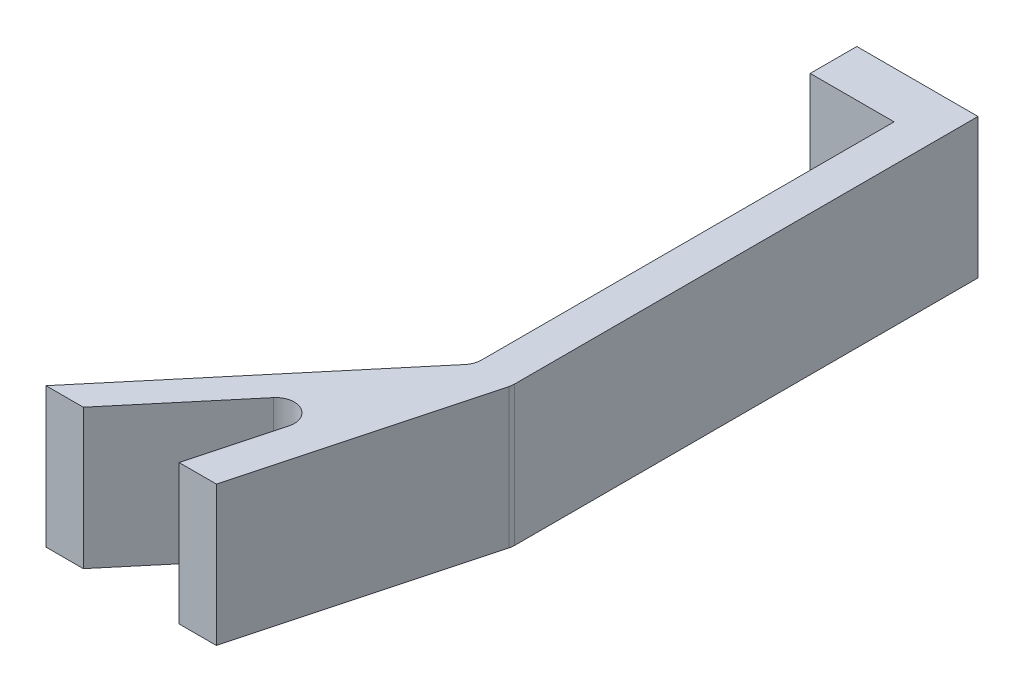
ISO-10303-21;
HEADER;
FILE_DESCRIPTION(('STEP AP214'),'2;1');
FILE_NAME('part.step','',(''),(''),'','','');
FILE_SCHEMA(('AUTOMOTIVE_DESIGN { 1 0 10303 214 1 1 1 1 }'));
ENDSEC;
DATA;
#1=APPLICATION_CONTEXT('core data for automotive mechanical design processes');
#2=APPLICATION_PROTOCOL_DEFINITION('international standard','automotive_design',2000,#1);
#3=PRODUCT_CONTEXT('',#1,'mechanical');
#4=PRODUCT('Part','Part','',(#3));
#5=PRODUCT_RELATED_PRODUCT_CATEGORY('part','',(#4));
#6=PRODUCT_DEFINITION_FORMATION('','',#4);
#7=PRODUCT_DEFINITION_CONTEXT('part definition',#1,'design');
#8=PRODUCT_DEFINITION('design','',#6,#7);
#9=PRODUCT_DEFINITION_SHAPE('','',#8);
#10=(LENGTH_UNIT() NAMED_UNIT(*) SI_UNIT(.MILLI.,.METRE.));
#11=(NAMED_UNIT(*) PLANE_ANGLE_UNIT() SI_UNIT($,.RADIAN.));
#12=(NAMED_UNIT(*) SI_UNIT($,.STERADIAN.) SOLID_ANGLE_UNIT());
#13=UNCERTAINTY_MEASURE_WITH_UNIT(LENGTH_MEASURE(1.E-05),#10,'distance_accuracy_value','');
#14=(GEOMETRIC_REPRESENTATION_CONTEXT(3) GLOBAL_UNCERTAINTY_ASSIGNED_CONTEXT((#13)) GLOBAL_UNIT_ASSIGNED_CONTEXT((#10,
#11,#12)) REPRESENTATION_CONTEXT('',''));
#15=CARTESIAN_POINT('',(0.,0.,0.));
#16=DIRECTION('',(0.,0.,1.));
#17=DIRECTION('',(1.,0.,0.));
#18=AXIS2_PLACEMENT_3D('',#15,#16,#17);
#19=CARTESIAN_POINT('',(2.,15.,-50.));
#20=DIRECTION('',(0.,0.,1.));
#21=DIRECTION('',(1.,0.,0.));
#22=AXIS2_PLACEMENT_3D('',#19,#20,#21);
#23=PLANE('',#22);
#24=CARTESIAN_POINT('',(-4.5,7.5,-50.));
#25=DIRECTION('',(0.,0.,-1.));
#26=DIRECTION('',(-1.,0.,0.));
#27=AXIS2_PLACEMENT_3D('',#24,#25,#26);
#28=CIRCLE('',#27,1.5);
#29=CARTESIAN_POINT('',(-6.,7.5,-50.));
#30=VERTEX_POINT('',#29);
#31=EDGE_CURVE('E275',#30,#30,#28,.T.);
#32=ORIENTED_EDGE('',*,*,#31,.F.);
#33=EDGE_LOOP('',(#32));
#34=FACE_BOUND('',#33,.T.);
#35=DIRECTION('',(-1.,0.,0.));
#36=VECTOR('',#35,1.);
#37=CARTESIAN_POINT('',(2.,0.,-50.));
#38=LINE('',#37,#36);
#39=CARTESIAN_POINT('',(2.,0.,-50.));
#40=VERTEX_POINT('',#39);
#41=CARTESIAN_POINT('',(-11.,0.,-50.));
#42=VERTEX_POINT('',#41);
#43=EDGE_CURVE('E170',#40,#42,#38,.T.);
#44=ORIENTED_EDGE('',*,*,#43,.T.);
#45=DIRECTION('',(0.,-1.,0.));
#46=VECTOR('',#45,1.);
#47=CARTESIAN_POINT('',(-11.,15.,-50.));
#48=LINE('',#47,#46);
#49=CARTESIAN_POINT('',(-11.,15.,-50.));
#50=VERTEX_POINT('',#49);
#51=EDGE_CURVE('E42',#50,#42,#48,.T.);
#52=ORIENTED_EDGE('',*,*,#51,.F.);
#53=DIRECTION('',(-1.,0.,0.));
#54=VECTOR('',#53,1.);
#55=CARTESIAN_POINT('',(2.,15.,-50.));
#56=LINE('',#55,#54);
#57=CARTESIAN_POINT('',(2.,15.,-50.));
#58=VERTEX_POINT('',#57);
#59=EDGE_CURVE('E112',#58,#50,#56,.T.);
#60=ORIENTED_EDGE('',*,*,#59,.F.);
#61=DIRECTION('',(0.,-1.,0.));
#62=VECTOR('',#61,1.);
#63=CARTESIAN_POINT('',(2.,15.,-50.));
#64=LINE('',#63,#62);
#65=EDGE_CURVE('E11',#58,#40,#64,.T.);
#66=ORIENTED_EDGE('',*,*,#65,.T.);
#67=EDGE_LOOP('',(#44,#52,#60,#66));
#68=FACE_BOUND('',#67,.T.);
#69=ADVANCED_FACE('F33',(#34,#68),#23,.F.);
#70=CARTESIAN_POINT('',(-11.,15.,-50.));
#71=DIRECTION('',(1.,0.,0.));
#72=DIRECTION('',(0.,0.,-1.));
#73=AXIS2_PLACEMENT_3D('',#70,#71,#72);
#74=PLANE('',#73);
#75=DIRECTION('',(0.,0.,1.));
#76=VECTOR('',#75,1.);
#77=CARTESIAN_POINT('',(-11.,0.,-50.));
#78=LINE('',#77,#76);
#79=CARTESIAN_POINT('',(-11.,0.,-45.));
#80=VERTEX_POINT('',#79);
#81=EDGE_CURVE('E172',#42,#80,#78,.T.);
#82=ORIENTED_EDGE('',*,*,#81,.T.);
#83=DIRECTION('',(0.,-1.,0.));
#84=VECTOR('',#83,1.);
#85=CARTESIAN_POINT('',(-11.,15.,-45.));
#86=LINE('',#85,#84);
#87=CARTESIAN_POINT('',(-11.,15.,-45.));
#88=VERTEX_POINT('',#87);
#89=EDGE_CURVE('E220',#88,#80,#86,.T.);
#90=ORIENTED_EDGE('',*,*,#89,.F.);
#91=DIRECTION('',(0.,0.,1.));
#92=VECTOR('',#91,1.);
#93=CARTESIAN_POINT('',(-11.,15.,-50.));
#94=LINE('',#93,#92);
#95=EDGE_CURVE('E229',#50,#88,#94,.T.);
#96=ORIENTED_EDGE('',*,*,#95,.F.);
#97=ORIENTED_EDGE('',*,*,#51,.T.);
#98=EDGE_LOOP('',(#82,#90,#96,#97));
#99=FACE_BOUND('',#98,.T.);
#100=ADVANCED_FACE('F227',(#99),#74,.F.);
#101=CARTESIAN_POINT('',(-11.,15.,-45.));
#102=DIRECTION('',(0.,0.,-1.));
#103=DIRECTION('',(-1.,0.,0.));
#104=AXIS2_PLACEMENT_3D('',#101,#102,#103);
#105=PLANE('',#104);
#106=CARTESIAN_POINT('',(-4.5,7.5,-45.));
#107=DIRECTION('',(0.,0.,-1.));
#108=DIRECTION('',(-1.,0.,0.));
#109=AXIS2_PLACEMENT_3D('',#106,#107,#108);
#110=CIRCLE('',#109,1.5);
#111=CARTESIAN_POINT('',(-6.,7.5,-45.));
#112=VERTEX_POINT('',#111);
#113=EDGE_CURVE('E36',#112,#112,#110,.T.);
#114=ORIENTED_EDGE('',*,*,#113,.T.);
#115=EDGE_LOOP('',(#114));
#116=FACE_BOUND('',#115,.T.);
#117=DIRECTION('',(1.,0.,0.));
#118=VECTOR('',#117,1.);
#119=CARTESIAN_POINT('',(-11.,0.,-45.));
#120=LINE('',#119,#118);
#121=CARTESIAN_POINT('',(-2.,0.,-45.));
#122=VERTEX_POINT('',#121);
#123=EDGE_CURVE('E174',#80,#122,#120,.T.);
#124=ORIENTED_EDGE('',*,*,#123,.T.);
#125=DIRECTION('',(0.,-1.,0.));
#126=VECTOR('',#125,1.);
#127=CARTESIAN_POINT('',(-2.,15.,-45.));
#128=LINE('',#127,#126);
#129=CARTESIAN_POINT('',(-2.,15.,-45.));
#130=VERTEX_POINT('',#129);
#131=EDGE_CURVE('E217',#130,#122,#128,.T.);
#132=ORIENTED_EDGE('',*,*,#131,.F.);
#133=DIRECTION('',(1.,0.,0.));
#134=VECTOR('',#133,1.);
#135=CARTESIAN_POINT('',(-11.,15.,-45.));
#136=LINE('',#135,#134);
#137=EDGE_CURVE('E247',#88,#130,#136,.T.);
#138=ORIENTED_EDGE('',*,*,#137,.F.);
#139=ORIENTED_EDGE('',*,*,#89,.T.);
#140=EDGE_LOOP('',(#124,#132,#138,#139));
#141=FACE_BOUND('',#140,.T.);
#142=ADVANCED_FACE('F238',(#116,#141),#105,.F.);
#143=CARTESIAN_POINT('',(-2.,15.,-0.727940468532419));
#144=DIRECTION('',(1.,0.,0.));
#145=DIRECTION('',(0.,0.,-1.));
#146=AXIS2_PLACEMENT_3D('',#143,#144,#145);
#147=PLANE('',#146);
#148=DIRECTION('',(0.,0.,1.));
#149=VECTOR('',#148,1.);
#150=CARTESIAN_POINT('',(-2.,0.,-0.727940468532419));
#151=LINE('',#150,#149);
#152=CARTESIAN_POINT('',(-2.,0.,-0.727940468532419));
#153=VERTEX_POINT('',#152);
#154=EDGE_CURVE('E177',#122,#153,#151,.T.);
#155=ORIENTED_EDGE('',*,*,#154,.T.);
#156=DIRECTION('',(0.,-1.,0.));
#157=VECTOR('',#156,1.);
#158=CARTESIAN_POINT('',(-2.,15.,-0.727940468532419));
#159=LINE('',#158,#157);
#160=CARTESIAN_POINT('',(-2.,15.,-0.727940468532419));
#161=VERTEX_POINT('',#160);
#162=EDGE_CURVE('E214',#161,#153,#159,.T.);
#163=ORIENTED_EDGE('',*,*,#162,.F.);
#164=DIRECTION('',(0.,0.,1.));
#165=VECTOR('',#164,1.);
#166=CARTESIAN_POINT('',(-2.,15.,-45.));
#167=LINE('',#166,#165);
#168=EDGE_CURVE('E244',#130,#161,#167,.T.);
#169=ORIENTED_EDGE('',*,*,#168,.F.);
#170=ORIENTED_EDGE('',*,*,#131,.T.);
#171=EDGE_LOOP('',(#155,#163,#169,#170));
#172=FACE_BOUND('',#171,.T.);
#173=ADVANCED_FACE('F242',(#172),#147,.F.);
#174=CARTESIAN_POINT('',(-4.,15.,-0.727940468532411));
#175=DIRECTION('',(0.,-1.,0.));
#176=DIRECTION('',(0.,0.,-1.));
#177=AXIS2_PLACEMENT_3D('',#174,#175,#176);
#178=CYLINDRICAL_SURFACE('',#177,2.);
#179=CARTESIAN_POINT('',(-4.,0.,-0.727940468532411));
#180=DIRECTION('',(0.,-1.,0.));
#181=DIRECTION('',(0.,0.,1.));
#182=AXIS2_PLACEMENT_3D('',#179,#180,#181);
#183=CIRCLE('',#182,2.);
#184=CARTESIAN_POINT('',(-2.46791111376206,0.,0.557634750840682));
#185=VERTEX_POINT('',#184);
#186=EDGE_CURVE('E179',#153,#185,#183,.T.);
#187=ORIENTED_EDGE('',*,*,#186,.T.);
#188=DIRECTION('',(0.,-1.,0.));
#189=VECTOR('',#188,1.);
#190=CARTESIAN_POINT('',(-2.46791111376206,15.,0.557634750840682));
#191=LINE('',#190,#189);
#192=CARTESIAN_POINT('',(-2.46791111376206,15.,0.557634750840682));
#193=VERTEX_POINT('',#192);
#194=EDGE_CURVE('E211',#193,#185,#191,.T.);
#195=ORIENTED_EDGE('',*,*,#194,.F.);
#196=CARTESIAN_POINT('',(-4.,15.,-0.727940468532411));
#197=DIRECTION('',(0.,-1.,0.));
#198=DIRECTION('',(0.,0.,1.));
#199=AXIS2_PLACEMENT_3D('',#196,#197,#198);
#200=CIRCLE('',#199,2.);
#201=EDGE_CURVE('E246',#161,#193,#200,.T.);
#202=ORIENTED_EDGE('',*,*,#201,.F.);
#203=ORIENTED_EDGE('',*,*,#162,.T.);
#204=EDGE_LOOP('',(#187,#195,#202,#203));
#205=FACE_BOUND('',#204,.T.);
#206=ADVANCED_FACE('F303',(#205),#178,.F.);
#207=CARTESIAN_POINT('',(-2.46791111376206,15.,0.557634750840682));
#208=DIRECTION('',(0.766044443118974,0.,0.642787609686543));
#209=DIRECTION('',(0.642787609686544,0.,-0.766044443118975));
#210=AXIS2_PLACEMENT_3D('',#207,#208,#209);
#211=PLANE('',#210);
#212=DIRECTION('',(-0.642787609686544,0.,0.766044443118975));
#213=VECTOR('',#212,1.);
#214=CARTESIAN_POINT('',(-2.46791111376206,0.,0.557634750840682));
#215=LINE('',#214,#213);
#216=CARTESIAN_POINT('',(-22.9774907794322,0.,25.));
#217=VERTEX_POINT('',#216);
#218=EDGE_CURVE('E181',#185,#217,#215,.T.);
#219=ORIENTED_EDGE('',*,*,#218,.T.);
#220=DIRECTION('',(0.,-1.,0.));
#221=VECTOR('',#220,1.);
#222=CARTESIAN_POINT('',(-22.9774907794322,15.,25.));
#223=LINE('',#222,#221);
#224=CARTESIAN_POINT('',(-22.9774907794322,15.,25.));
#225=VERTEX_POINT('',#224);
#226=EDGE_CURVE('E208',#225,#217,#223,.T.);
#227=ORIENTED_EDGE('',*,*,#226,.F.);
#228=DIRECTION('',(-0.642787609686544,0.,0.766044443118975));
#229=VECTOR('',#228,1.);
#230=CARTESIAN_POINT('',(-2.46791111376206,15.,0.557634750840682));
#231=LINE('',#230,#229);
#232=EDGE_CURVE('E249',#193,#225,#231,.T.);
#233=ORIENTED_EDGE('',*,*,#232,.F.);
#234=ORIENTED_EDGE('',*,*,#194,.T.);
#235=EDGE_LOOP('',(#219,#227,#233,#234));
#236=FACE_BOUND('',#235,.T.);
#237=ADVANCED_FACE('F306',(#236),#211,.F.);
#238=CARTESIAN_POINT('',(-22.9774907794322,15.,25.));
#239=DIRECTION('',(0.,0.,-1.));
#240=DIRECTION('',(-1.,0.,0.));
#241=AXIS2_PLACEMENT_3D('',#238,#239,#240);
#242=PLANE('',#241);
#243=DIRECTION('',(1.,0.,0.));
#244=VECTOR('',#243,1.);
#245=CARTESIAN_POINT('',(-22.9774907794322,0.,25.));
#246=LINE('',#245,#244);
#247=CARTESIAN_POINT('',(-18.9774907794322,0.,25.));
#248=VERTEX_POINT('',#247);
#249=EDGE_CURVE('E183',#217,#248,#246,.T.);
#250=ORIENTED_EDGE('',*,*,#249,.T.);
#251=DIRECTION('',(0.,-1.,0.));
#252=VECTOR('',#251,1.);
#253=CARTESIAN_POINT('',(-18.9774907794322,15.,25.));
#254=LINE('',#253,#252);
#255=CARTESIAN_POINT('',(-18.9774907794322,15.,25.));
#256=VERTEX_POINT('',#255);
#257=EDGE_CURVE('E205',#256,#248,#254,.T.);
#258=ORIENTED_EDGE('',*,*,#257,.F.);
#259=DIRECTION('',(1.,0.,0.));
#260=VECTOR('',#259,1.);
#261=CARTESIAN_POINT('',(-22.9774907794322,15.,25.));
#262=LINE('',#261,#260);
#263=EDGE_CURVE('E255',#225,#256,#262,.T.);
#264=ORIENTED_EDGE('',*,*,#263,.F.);
#265=ORIENTED_EDGE('',*,*,#226,.T.);
#266=EDGE_LOOP('',(#250,#258,#264,#265));
#267=FACE_BOUND('',#266,.T.);
#268=ADVANCED_FACE('F310',(#267),#242,.F.);
#269=CARTESIAN_POINT('',(-9.67541280220184,15.,13.9142151520443));
#270=DIRECTION('',(-0.766044443118975,0.,-0.642787609686544));
#271=DIRECTION('',(-0.642787609686543,0.,0.766044443118974));
#272=AXIS2_PLACEMENT_3D('',#269,#270,#271);
#273=PLANE('',#272);
#274=DIRECTION('',(0.642787609686543,0.,-0.766044443118975));
#275=VECTOR('',#274,1.);
#276=CARTESIAN_POINT('',(-9.67541280220184,0.,13.9142151520443));
#277=LINE('',#276,#275);
#278=CARTESIAN_POINT('',(-9.67541280220184,0.,13.9142151520443));
#279=VERTEX_POINT('',#278);
#280=EDGE_CURVE('E185',#248,#279,#277,.T.);
#281=ORIENTED_EDGE('',*,*,#280,.T.);
#282=DIRECTION('',(0.,-1.,0.));
#283=VECTOR('',#282,1.);
#284=CARTESIAN_POINT('',(-9.67541280220184,15.,13.9142151520443));
#285=LINE('',#284,#283);
#286=CARTESIAN_POINT('',(-9.67541280220184,15.,13.9142151520443));
#287=VERTEX_POINT('',#286);
#288=EDGE_CURVE('E202',#287,#279,#285,.T.);
#289=ORIENTED_EDGE('',*,*,#288,.F.);
#290=DIRECTION('',(0.642787609686543,0.,-0.766044443118975));
#291=VECTOR('',#290,1.);
#292=CARTESIAN_POINT('',(-9.67541280220184,15.,13.9142151520443));
#293=LINE('',#292,#291);
#294=EDGE_CURVE('E257',#256,#287,#293,.T.);
#295=ORIENTED_EDGE('',*,*,#294,.F.);
#296=ORIENTED_EDGE('',*,*,#257,.T.);
#297=EDGE_LOOP('',(#281,#289,#295,#296));
#298=FACE_BOUND('',#297,.T.);
#299=ADVANCED_FACE('F314',(#298),#273,.F.);
#300=CARTESIAN_POINT('',(-8.1433239159638,15.,15.1997903714173));
#301=DIRECTION('',(0.,-1.,0.));
#302=DIRECTION('',(0.,0.,-1.));
#303=AXIS2_PLACEMENT_3D('',#300,#301,#302);
#304=CYLINDRICAL_SURFACE('',#303,2.);
#305=CARTESIAN_POINT('',(-8.1433239159638,0.,15.1997903714173));
#306=DIRECTION('',(0.,-1.,0.));
#307=DIRECTION('',(0.,0.,1.));
#308=AXIS2_PLACEMENT_3D('',#305,#306,#307);
#309=CIRCLE('',#308,2.);
#310=CARTESIAN_POINT('',(-6.2114722633857,0.,15.7174284616225));
#311=VERTEX_POINT('',#310);
#312=EDGE_CURVE('E187',#279,#311,#309,.T.);
#313=ORIENTED_EDGE('',*,*,#312,.T.);
#314=DIRECTION('',(0.,-1.,0.));
#315=VECTOR('',#314,1.);
#316=CARTESIAN_POINT('',(-6.2114722633857,15.,15.7174284616225));
#317=LINE('',#316,#315);
#318=CARTESIAN_POINT('',(-6.2114722633857,15.,15.7174284616225));
#319=VERTEX_POINT('',#318);
#320=EDGE_CURVE('E199',#319,#311,#317,.T.);
#321=ORIENTED_EDGE('',*,*,#320,.F.);
#322=CARTESIAN_POINT('',(-8.1433239159638,15.,15.1997903714173));
#323=DIRECTION('',(0.,-1.,0.));
#324=DIRECTION('',(0.,0.,1.));
#325=AXIS2_PLACEMENT_3D('',#322,#323,#324);
#326=CIRCLE('',#325,2.);
#327=EDGE_CURVE('E259',#287,#319,#326,.T.);
#328=ORIENTED_EDGE('',*,*,#327,.F.);
#329=ORIENTED_EDGE('',*,*,#288,.T.);
#330=EDGE_LOOP('',(#313,#321,#328,#329));
#331=FACE_BOUND('',#330,.T.);
#332=ADVANCED_FACE('F265',(#331),#304,.F.);
#333=CARTESIAN_POINT('',(-6.2114722633857,15.,15.7174284616225));
#334=DIRECTION('',(0.965925826289068,0.,0.258819045102521));
#335=DIRECTION('',(0.258819045102521,0.,-0.965925826289068));
#336=AXIS2_PLACEMENT_3D('',#333,#334,#335);
#337=PLANE('',#336);
#338=DIRECTION('',(-0.258819045102521,0.,0.965925826289068));
#339=VECTOR('',#338,1.);
#340=CARTESIAN_POINT('',(-6.2114722633857,0.,15.7174284616225));
#341=LINE('',#340,#339);
#342=CARTESIAN_POINT('',(-8.69872981077808,0.,25.));
#343=VERTEX_POINT('',#342);
#344=EDGE_CURVE('E189',#311,#343,#341,.T.);
#345=ORIENTED_EDGE('',*,*,#344,.T.);
#346=DIRECTION('',(0.,-1.,0.));
#347=VECTOR('',#346,1.);
#348=CARTESIAN_POINT('',(-8.69872981077808,15.,25.));
#349=LINE('',#348,#347);
#350=CARTESIAN_POINT('',(-8.69872981077808,15.,25.));
#351=VERTEX_POINT('',#350);
#352=EDGE_CURVE('E159',#351,#343,#349,.T.);
#353=ORIENTED_EDGE('',*,*,#352,.F.);
#354=DIRECTION('',(-0.258819045102521,0.,0.965925826289068));
#355=VECTOR('',#354,1.);
#356=CARTESIAN_POINT('',(-6.2114722633857,15.,15.7174284616225));
#357=LINE('',#356,#355);
#358=EDGE_CURVE('E150',#319,#351,#357,.T.);
#359=ORIENTED_EDGE('',*,*,#358,.F.);
#360=ORIENTED_EDGE('',*,*,#320,.T.);
#361=EDGE_LOOP('',(#345,#353,#359,#360));
#362=FACE_BOUND('',#361,.T.);
#363=ADVANCED_FACE('F269',(#362),#337,.F.);
#364=CARTESIAN_POINT('',(-8.69872981077808,15.,25.));
#365=DIRECTION('',(0.,0.,-1.));
#366=DIRECTION('',(-1.,0.,0.));
#367=AXIS2_PLACEMENT_3D('',#364,#365,#366);
#368=PLANE('',#367);
#369=DIRECTION('',(1.,0.,0.));
#370=VECTOR('',#369,1.);
#371=CARTESIAN_POINT('',(-8.69872981077808,0.,25.));
#372=LINE('',#371,#370);
#373=CARTESIAN_POINT('',(-4.69872981077808,0.,25.));
#374=VERTEX_POINT('',#373);
#375=EDGE_CURVE('E158',#343,#374,#372,.T.);
#376=ORIENTED_EDGE('',*,*,#375,.T.);
#377=DIRECTION('',(0.,-1.,0.));
#378=VECTOR('',#377,1.);
#379=CARTESIAN_POINT('',(-4.69872981077808,15.,25.));
#380=LINE('',#379,#378);
#381=CARTESIAN_POINT('',(-4.69872981077808,15.,25.));
#382=VERTEX_POINT('',#381);
#383=EDGE_CURVE('E155',#382,#374,#380,.T.);
#384=ORIENTED_EDGE('',*,*,#383,.F.);
#385=DIRECTION('',(1.,0.,0.));
#386=VECTOR('',#385,1.);
#387=CARTESIAN_POINT('',(-8.69872981077808,15.,25.));
#388=LINE('',#387,#386);
#389=EDGE_CURVE('E144',#351,#382,#388,.T.);
#390=ORIENTED_EDGE('',*,*,#389,.F.);
#391=ORIENTED_EDGE('',*,*,#352,.T.);
#392=EDGE_LOOP('',(#376,#384,#390,#391));
#393=FACE_BOUND('',#392,.T.);
#394=ADVANCED_FACE('F156',(#393),#368,.F.);
#395=CARTESIAN_POINT('',(1.93185165257813,15.,0.254333095030257));
#396=DIRECTION('',(-0.965925826289068,0.,-0.258819045102521));
#397=DIRECTION('',(-0.258819045102521,0.,0.965925826289068));
#398=AXIS2_PLACEMENT_3D('',#395,#396,#397);
#399=PLANE('',#398);
#400=DIRECTION('',(0.258819045102521,0.,-0.965925826289068));
#401=VECTOR('',#400,1.);
#402=CARTESIAN_POINT('',(1.93185165257813,0.,0.254333095030257));
#403=LINE('',#402,#401);
#404=CARTESIAN_POINT('',(1.93185165257813,0.,0.254333095030258));
#405=VERTEX_POINT('',#404);
#406=EDGE_CURVE('E98',#374,#405,#403,.T.);
#407=ORIENTED_EDGE('',*,*,#406,.T.);
#408=DIRECTION('',(0.,-1.,0.));
#409=VECTOR('',#408,1.);
#410=CARTESIAN_POINT('',(1.93185165257813,15.,0.254333095030258));
#411=LINE('',#410,#409);
#412=CARTESIAN_POINT('',(1.93185165257813,15.,0.254333095030258));
#413=VERTEX_POINT('',#412);
#414=EDGE_CURVE('E160',#413,#405,#411,.T.);
#415=ORIENTED_EDGE('',*,*,#414,.F.);
#416=DIRECTION('',(0.258819045102521,0.,-0.965925826289068));
#417=VECTOR('',#416,1.);
#418=CARTESIAN_POINT('',(1.93185165257813,15.,0.254333095030257));
#419=LINE('',#418,#417);
#420=EDGE_CURVE('E148',#382,#413,#419,.T.);
#421=ORIENTED_EDGE('',*,*,#420,.F.);
#422=ORIENTED_EDGE('',*,*,#383,.T.);
#423=EDGE_LOOP('',(#407,#415,#421,#422));
#424=FACE_BOUND('',#423,.T.);
#425=ADVANCED_FACE('F162',(#424),#399,.F.);
#426=CARTESIAN_POINT('',(0.,15.,-0.263304995174792));
#427=DIRECTION('',(0.,-1.,0.));
#428=DIRECTION('',(0.,0.,-1.));
#429=AXIS2_PLACEMENT_3D('',#426,#427,#428);
#430=CYLINDRICAL_SURFACE('',#429,2.);
#431=CARTESIAN_POINT('',(0.,0.,-0.263304995174792));
#432=DIRECTION('',(0.,1.,0.));
#433=DIRECTION('',(0.,0.,1.));
#434=AXIS2_PLACEMENT_3D('',#431,#432,#433);
#435=CIRCLE('',#434,2.);
#436=CARTESIAN_POINT('',(2.,0.,-0.2633049951748));
#437=VERTEX_POINT('',#436);
#438=EDGE_CURVE('E105',#405,#437,#435,.T.);
#439=ORIENTED_EDGE('',*,*,#438,.T.);
#440=DIRECTION('',(0.,-1.,0.));
#441=VECTOR('',#440,1.);
#442=CARTESIAN_POINT('',(2.,15.,-0.2633049951748));
#443=LINE('',#442,#441);
#444=CARTESIAN_POINT('',(2.,15.,-0.2633049951748));
#445=VERTEX_POINT('',#444);
#446=EDGE_CURVE('E166',#445,#437,#443,.T.);
#447=ORIENTED_EDGE('',*,*,#446,.F.);
#448=CARTESIAN_POINT('',(0.,15.,-0.263304995174792));
#449=DIRECTION('',(0.,1.,0.));
#450=DIRECTION('',(0.,0.,1.));
#451=AXIS2_PLACEMENT_3D('',#448,#449,#450);
#452=CIRCLE('',#451,2.);
#453=EDGE_CURVE('E164',#413,#445,#452,.T.);
#454=ORIENTED_EDGE('',*,*,#453,.F.);
#455=ORIENTED_EDGE('',*,*,#414,.T.);
#456=EDGE_LOOP('',(#439,#447,#454,#455));
#457=FACE_BOUND('',#456,.T.);
#458=ADVANCED_FACE('F271',(#457),#430,.T.);
#459=CARTESIAN_POINT('',(2.,15.,-0.2633049951748));
#460=DIRECTION('',(-1.,0.,0.));
#461=DIRECTION('',(0.,0.,1.));
#462=AXIS2_PLACEMENT_3D('',#459,#460,#461);
#463=PLANE('',#462);
#464=DIRECTION('',(0.,0.,-1.));
#465=VECTOR('',#464,1.);
#466=CARTESIAN_POINT('',(2.,0.,-0.2633049951748));
#467=LINE('',#466,#465);
#468=EDGE_CURVE('E194',#437,#40,#467,.T.);
#469=ORIENTED_EDGE('',*,*,#468,.T.);
#470=ORIENTED_EDGE('',*,*,#65,.F.);
#471=DIRECTION('',(0.,0.,-1.));
#472=VECTOR('',#471,1.);
#473=CARTESIAN_POINT('',(2.,15.,-30.));
#474=LINE('',#473,#472);
#475=EDGE_CURVE('E50',#445,#58,#474,.T.);
#476=ORIENTED_EDGE('',*,*,#475,.F.);
#477=ORIENTED_EDGE('',*,*,#446,.T.);
#478=EDGE_LOOP('',(#469,#470,#476,#477));
#479=FACE_BOUND('',#478,.T.);
#480=ADVANCED_FACE('F270',(#479),#463,.F.);
#481=CARTESIAN_POINT('',(-4.,15.,-0.727940468532411));
#482=DIRECTION('',(0.,1.,0.));
#483=DIRECTION('',(0.,0.,1.));
#484=AXIS2_PLACEMENT_3D('',#481,#482,#483);
#485=PLANE('',#484);
#486=ORIENTED_EDGE('',*,*,#475,.T.);
#487=ORIENTED_EDGE('',*,*,#59,.T.);
#488=ORIENTED_EDGE('',*,*,#95,.T.);
#489=ORIENTED_EDGE('',*,*,#137,.T.);
#490=ORIENTED_EDGE('',*,*,#168,.T.);
#491=ORIENTED_EDGE('',*,*,#201,.T.);
#492=ORIENTED_EDGE('',*,*,#232,.T.);
#493=ORIENTED_EDGE('',*,*,#263,.T.);
#494=ORIENTED_EDGE('',*,*,#294,.T.);
#495=ORIENTED_EDGE('',*,*,#327,.T.);
#496=ORIENTED_EDGE('',*,*,#358,.T.);
#497=ORIENTED_EDGE('',*,*,#389,.T.);
#498=ORIENTED_EDGE('',*,*,#420,.T.);
#499=ORIENTED_EDGE('',*,*,#453,.T.);
#500=EDGE_LOOP('',(#486,#487,#488,#489,#490,#491,#492,#493,#494,#495,#496,#497,#498,#499));
#501=FACE_BOUND('',#500,.T.);
#502=ADVANCED_FACE('F146',(#501),#485,.T.);
#503=CARTESIAN_POINT('',(-4.,0.,-0.727940468532411));
#504=DIRECTION('',(0.,1.,0.));
#505=DIRECTION('',(0.,0.,1.));
#506=AXIS2_PLACEMENT_3D('',#503,#504,#505);
#507=PLANE('',#506);
#508=ORIENTED_EDGE('',*,*,#43,.F.);
#509=ORIENTED_EDGE('',*,*,#468,.F.);
#510=ORIENTED_EDGE('',*,*,#438,.F.);
#511=ORIENTED_EDGE('',*,*,#406,.F.);
#512=ORIENTED_EDGE('',*,*,#375,.F.);
#513=ORIENTED_EDGE('',*,*,#344,.F.);
#514=ORIENTED_EDGE('',*,*,#312,.F.);
#515=ORIENTED_EDGE('',*,*,#280,.F.);
#516=ORIENTED_EDGE('',*,*,#249,.F.);
#517=ORIENTED_EDGE('',*,*,#218,.F.);
#518=ORIENTED_EDGE('',*,*,#186,.F.);
#519=ORIENTED_EDGE('',*,*,#154,.F.);
#520=ORIENTED_EDGE('',*,*,#123,.F.);
#521=ORIENTED_EDGE('',*,*,#81,.F.);
#522=EDGE_LOOP('',(#508,#509,#510,#511,#512,#513,#514,#515,#516,#517,#518,#519,#520,#521));
#523=FACE_BOUND('',#522,.T.);
#524=ADVANCED_FACE('F233',(#523),#507,.F.);
#525=CARTESIAN_POINT('',(-4.5,7.5,-40.));
#526=DIRECTION('',(0.,0.,-1.));
#527=DIRECTION('',(-1.,0.,0.));
#528=AXIS2_PLACEMENT_3D('',#525,#526,#527);
#529=CYLINDRICAL_SURFACE('',#528,1.5);
#530=ORIENTED_EDGE('',*,*,#31,.T.);
#531=EDGE_LOOP('',(#530));
#532=FACE_BOUND('',#531,.T.);
#533=ORIENTED_EDGE('',*,*,#113,.F.);
#534=EDGE_LOOP('',(#533));
#535=FACE_BOUND('',#534,.T.);
#536=ADVANCED_FACE('F283',(#532,#535),#529,.F.);
#537=CLOSED_SHELL('',(#69,#100,#142,#173,#206,#237,#268,#299,#332,#363,#394,#425,#458,#480,#502,
#524,#536));
#538=MANIFOLD_SOLID_BREP('B2',#537);
#539=ADVANCED_BREP_SHAPE_REPRESENTATION('',(#18,#538),#14);
#540=SHAPE_DEFINITION_REPRESENTATION(#9,#539);
ENDSEC;
END-ISO-10303-21;
